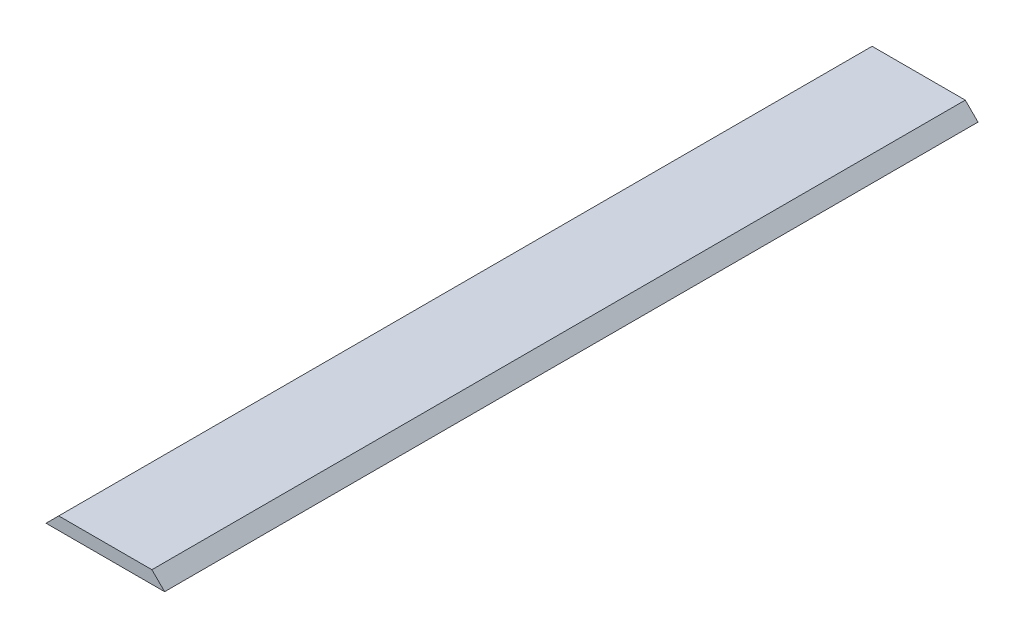
ISO-10303-21;
HEADER;
FILE_DESCRIPTION(('STEP AP214'),'2;1');
FILE_NAME('part.step','',(''),(''),'','','');
FILE_SCHEMA(('AUTOMOTIVE_DESIGN { 1 0 10303 214 1 1 1 1 }'));
ENDSEC;
DATA;
#1=APPLICATION_CONTEXT('core data for automotive mechanical design processes');
#2=APPLICATION_PROTOCOL_DEFINITION('international standard','automotive_design',2000,#1);
#3=PRODUCT_CONTEXT('',#1,'mechanical');
#4=PRODUCT('Part','Part','',(#3));
#5=PRODUCT_RELATED_PRODUCT_CATEGORY('part','',(#4));
#6=PRODUCT_DEFINITION_FORMATION('','',#4);
#7=PRODUCT_DEFINITION_CONTEXT('part definition',#1,'design');
#8=PRODUCT_DEFINITION('design','',#6,#7);
#9=PRODUCT_DEFINITION_SHAPE('','',#8);
#10=(LENGTH_UNIT() NAMED_UNIT(*) SI_UNIT(.MILLI.,.METRE.));
#11=(NAMED_UNIT(*) PLANE_ANGLE_UNIT() SI_UNIT($,.RADIAN.));
#12=(NAMED_UNIT(*) SI_UNIT($,.STERADIAN.) SOLID_ANGLE_UNIT());
#13=UNCERTAINTY_MEASURE_WITH_UNIT(LENGTH_MEASURE(1.E-05),#10,'distance_accuracy_value','');
#14=(GEOMETRIC_REPRESENTATION_CONTEXT(3) GLOBAL_UNCERTAINTY_ASSIGNED_CONTEXT((#13)) GLOBAL_UNIT_ASSIGNED_CONTEXT((#10,
#11,#12)) REPRESENTATION_CONTEXT('',''));
#15=CARTESIAN_POINT('',(0.,0.,0.));
#16=DIRECTION('',(0.,0.,1.));
#17=DIRECTION('',(1.,0.,0.));
#18=AXIS2_PLACEMENT_3D('',#15,#16,#17);
#19=CARTESIAN_POINT('',(-88.9,9.525,609.6));
#20=DIRECTION('',(0.,-1.,0.));
#21=DIRECTION('',(0.,0.,-1.));
#22=AXIS2_PLACEMENT_3D('',#19,#20,#21);
#23=PLANE('',#22);
#24=DIRECTION('',(-1.,0.,0.));
#25=VECTOR('',#24,1.);
#26=CARTESIAN_POINT('',(-88.9,9.525,-609.6));
#27=LINE('',#26,#25);
#28=CARTESIAN_POINT('',(69.8500000000001,9.525,-609.6));
#29=VERTEX_POINT('',#28);
#30=CARTESIAN_POINT('',(-69.8500000000001,9.525,-609.6));
#31=VERTEX_POINT('',#30);
#32=EDGE_CURVE('E93',#29,#31,#27,.T.);
#33=ORIENTED_EDGE('',*,*,#32,.T.);
#34=DIRECTION('',(0.,0.,1.));
#35=VECTOR('',#34,1.);
#36=CARTESIAN_POINT('',(-69.8500000000001,9.525,-609.6));
#37=LINE('',#36,#35);
#38=CARTESIAN_POINT('',(-69.8500000000001,9.525,609.6));
#39=VERTEX_POINT('',#38);
#40=EDGE_CURVE('E47',#31,#39,#37,.T.);
#41=ORIENTED_EDGE('',*,*,#40,.T.);
#42=DIRECTION('',(-1.,0.,0.));
#43=VECTOR('',#42,1.);
#44=CARTESIAN_POINT('',(-88.9,9.525,609.6));
#45=LINE('',#44,#43);
#46=CARTESIAN_POINT('',(69.8500000000001,9.525,609.6));
#47=VERTEX_POINT('',#46);
#48=EDGE_CURVE('E84',#47,#39,#45,.T.);
#49=ORIENTED_EDGE('',*,*,#48,.F.);
#50=DIRECTION('',(0.,0.,1.));
#51=VECTOR('',#50,1.);
#52=CARTESIAN_POINT('',(69.8500000000001,9.525,-609.6));
#53=LINE('',#52,#51);
#54=EDGE_CURVE('E85',#29,#47,#53,.T.);
#55=ORIENTED_EDGE('',*,*,#54,.F.);
#56=EDGE_LOOP('',(#33,#41,#49,#55));
#57=FACE_BOUND('',#56,.T.);
#58=ADVANCED_FACE('F33',(#57),#23,.F.);
#59=CARTESIAN_POINT('',(0.,0.,609.6));
#60=DIRECTION('',(0.,0.,-1.));
#61=DIRECTION('',(-1.,0.,0.));
#62=AXIS2_PLACEMENT_3D('',#59,#60,#61);
#63=PLANE('',#62);
#64=ORIENTED_EDGE('',*,*,#48,.T.);
#65=DIRECTION('',(0.707106781186546,0.707106781186549,0.));
#66=VECTOR('',#65,1.);
#67=CARTESIAN_POINT('',(-39.6875000000001,39.6875,609.6));
#68=LINE('',#67,#66);
#69=CARTESIAN_POINT('',(-88.9,-9.525,609.6));
#70=VERTEX_POINT('',#69);
#71=EDGE_CURVE('E71',#70,#39,#68,.T.);
#72=ORIENTED_EDGE('',*,*,#71,.F.);
#73=DIRECTION('',(1.,0.,0.));
#74=VECTOR('',#73,1.);
#75=CARTESIAN_POINT('',(-88.9,-9.525,609.6));
#76=LINE('',#75,#74);
#77=CARTESIAN_POINT('',(88.9,-9.525,609.6));
#78=VERTEX_POINT('',#77);
#79=EDGE_CURVE('E82',#70,#78,#76,.T.);
#80=ORIENTED_EDGE('',*,*,#79,.T.);
#81=DIRECTION('',(-0.707106781186547,0.707106781186549,0.));
#82=VECTOR('',#81,1.);
#83=CARTESIAN_POINT('',(39.6875000000001,39.6875,609.6));
#84=LINE('',#83,#82);
#85=EDGE_CURVE('E101',#78,#47,#84,.T.);
#86=ORIENTED_EDGE('',*,*,#85,.T.);
#87=EDGE_LOOP('',(#64,#72,#80,#86));
#88=FACE_BOUND('',#87,.T.);
#89=ADVANCED_FACE('F80',(#88),#63,.F.);
#90=CARTESIAN_POINT('',(0.,0.,-609.6));
#91=DIRECTION('',(0.,0.,-1.));
#92=DIRECTION('',(-1.,0.,0.));
#93=AXIS2_PLACEMENT_3D('',#90,#91,#92);
#94=PLANE('',#93);
#95=DIRECTION('',(0.707106781186546,0.707106781186549,0.));
#96=VECTOR('',#95,1.);
#97=CARTESIAN_POINT('',(-39.6875000000001,39.6875,-609.6));
#98=LINE('',#97,#96);
#99=CARTESIAN_POINT('',(-88.9,-9.525,-609.6));
#100=VERTEX_POINT('',#99);
#101=EDGE_CURVE('E72',#100,#31,#98,.T.);
#102=ORIENTED_EDGE('',*,*,#101,.T.);
#103=ORIENTED_EDGE('',*,*,#32,.F.);
#104=DIRECTION('',(-0.707106781186547,0.707106781186549,0.));
#105=VECTOR('',#104,1.);
#106=CARTESIAN_POINT('',(39.6875000000001,39.6875,-609.6));
#107=LINE('',#106,#105);
#108=CARTESIAN_POINT('',(88.9,-9.525,-609.6));
#109=VERTEX_POINT('',#108);
#110=EDGE_CURVE('E99',#109,#29,#107,.T.);
#111=ORIENTED_EDGE('',*,*,#110,.F.);
#112=DIRECTION('',(1.,0.,0.));
#113=VECTOR('',#112,1.);
#114=CARTESIAN_POINT('',(-88.9,-9.525,-609.6));
#115=LINE('',#114,#113);
#116=EDGE_CURVE('E89',#100,#109,#115,.T.);
#117=ORIENTED_EDGE('',*,*,#116,.F.);
#118=EDGE_LOOP('',(#102,#103,#111,#117));
#119=FACE_BOUND('',#118,.T.);
#120=ADVANCED_FACE('F97',(#119),#94,.T.);
#121=CARTESIAN_POINT('',(-88.9,-9.525,609.6));
#122=DIRECTION('',(0.,1.,0.));
#123=DIRECTION('',(0.,0.,1.));
#124=AXIS2_PLACEMENT_3D('',#121,#122,#123);
#125=PLANE('',#124);
#126=ORIENTED_EDGE('',*,*,#116,.T.);
#127=DIRECTION('',(0.,0.,-1.));
#128=VECTOR('',#127,1.);
#129=CARTESIAN_POINT('',(88.9,-9.525,609.6));
#130=LINE('',#129,#128);
#131=EDGE_CURVE('E40',#78,#109,#130,.T.);
#132=ORIENTED_EDGE('',*,*,#131,.F.);
#133=ORIENTED_EDGE('',*,*,#79,.F.);
#134=DIRECTION('',(0.,0.,-1.));
#135=VECTOR('',#134,1.);
#136=CARTESIAN_POINT('',(-88.9,-9.525,609.6));
#137=LINE('',#136,#135);
#138=EDGE_CURVE('E11',#70,#100,#137,.T.);
#139=ORIENTED_EDGE('',*,*,#138,.T.);
#140=EDGE_LOOP('',(#126,#132,#133,#139));
#141=FACE_BOUND('',#140,.T.);
#142=ADVANCED_FACE('F87',(#141),#125,.F.);
#143=CARTESIAN_POINT('',(39.6875000000001,39.6875,-609.6));
#144=DIRECTION('',(0.707106781186549,0.707106781186547,0.));
#145=DIRECTION('',(-0.707106781186547,0.707106781186549,0.));
#146=AXIS2_PLACEMENT_3D('',#143,#144,#145);
#147=PLANE('',#146);
#148=ORIENTED_EDGE('',*,*,#85,.F.);
#149=ORIENTED_EDGE('',*,*,#131,.T.);
#150=ORIENTED_EDGE('',*,*,#110,.T.);
#151=ORIENTED_EDGE('',*,*,#54,.T.);
#152=EDGE_LOOP('',(#148,#149,#150,#151));
#153=FACE_BOUND('',#152,.T.);
#154=ADVANCED_FACE('F107',(#153),#147,.T.);
#155=CARTESIAN_POINT('',(-39.6875000000001,39.6875,-609.6));
#156=DIRECTION('',(0.707106781186549,-0.707106781186546,0.));
#157=DIRECTION('',(0.707106781186546,0.707106781186549,0.));
#158=AXIS2_PLACEMENT_3D('',#155,#156,#157);
#159=PLANE('',#158);
#160=ORIENTED_EDGE('',*,*,#71,.T.);
#161=ORIENTED_EDGE('',*,*,#40,.F.);
#162=ORIENTED_EDGE('',*,*,#101,.F.);
#163=ORIENTED_EDGE('',*,*,#138,.F.);
#164=EDGE_LOOP('',(#160,#161,#162,#163));
#165=FACE_BOUND('',#164,.T.);
#166=ADVANCED_FACE('F70',(#165),#159,.F.);
#167=CLOSED_SHELL('',(#58,#89,#120,#142,#154,#166));
#168=MANIFOLD_SOLID_BREP('B2',#167);
#169=ADVANCED_BREP_SHAPE_REPRESENTATION('',(#18,#168),#14);
#170=SHAPE_DEFINITION_REPRESENTATION(#9,#169);
ENDSEC;
END-ISO-10303-21;
